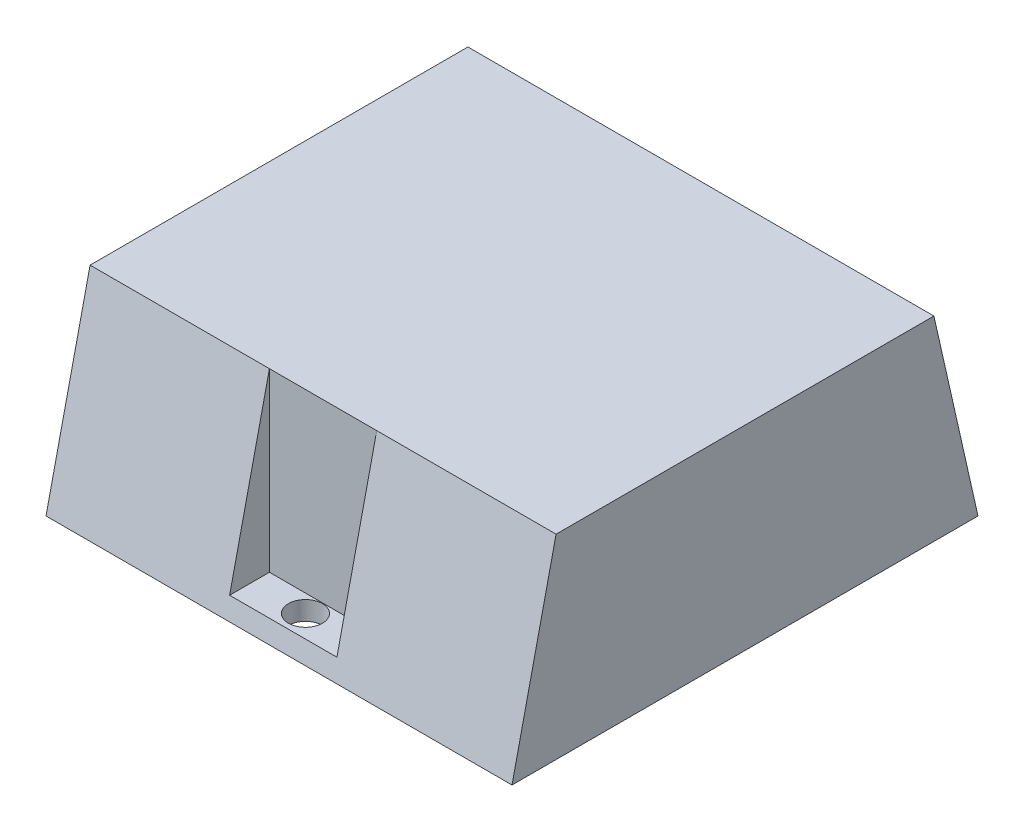
ISO-10303-21;
HEADER;
FILE_DESCRIPTION(('STEP AP214'),'2;1');
FILE_NAME('part.step','',(''),(''),'','','');
FILE_SCHEMA(('AUTOMOTIVE_DESIGN { 1 0 10303 214 1 1 1 1 }'));
ENDSEC;
DATA;
#1=APPLICATION_CONTEXT('core data for automotive mechanical design processes');
#2=APPLICATION_PROTOCOL_DEFINITION('international standard','automotive_design',2000,#1);
#3=PRODUCT_CONTEXT('',#1,'mechanical');
#4=PRODUCT('Part','Part','',(#3));
#5=PRODUCT_RELATED_PRODUCT_CATEGORY('part','',(#4));
#6=PRODUCT_DEFINITION_FORMATION('','',#4);
#7=PRODUCT_DEFINITION_CONTEXT('part definition',#1,'design');
#8=PRODUCT_DEFINITION('design','',#6,#7);
#9=PRODUCT_DEFINITION_SHAPE('','',#8);
#10=(LENGTH_UNIT() NAMED_UNIT(*) SI_UNIT(.MILLI.,.METRE.));
#11=(NAMED_UNIT(*) PLANE_ANGLE_UNIT() SI_UNIT($,.RADIAN.));
#12=(NAMED_UNIT(*) SI_UNIT($,.STERADIAN.) SOLID_ANGLE_UNIT());
#13=UNCERTAINTY_MEASURE_WITH_UNIT(LENGTH_MEASURE(1.E-05),#10,'distance_accuracy_value','');
#14=(GEOMETRIC_REPRESENTATION_CONTEXT(3) GLOBAL_UNCERTAINTY_ASSIGNED_CONTEXT((#13)) GLOBAL_UNIT_ASSIGNED_CONTEXT((#10,
#11,#12)) REPRESENTATION_CONTEXT('',''));
#15=CARTESIAN_POINT('',(0.,0.,0.));
#16=DIRECTION('',(0.,0.,1.));
#17=DIRECTION('',(1.,0.,0.));
#18=AXIS2_PLACEMENT_3D('',#15,#16,#17);
#19=CARTESIAN_POINT('',(37.,31.,30.));
#20=DIRECTION('',(0.,0.220260871434643,0.975441002067707));
#21=DIRECTION('',(0.,-0.975441002067707,0.220260871434643));
#22=AXIS2_PLACEMENT_3D('',#19,#20,#21);
#23=PLANE('',#22);
#24=DIRECTION('',(-1.,0.,0.));
#25=VECTOR('',#24,1.);
#26=CARTESIAN_POINT('',(37.,3.,36.3225806451613));
#27=LINE('',#26,#25);
#28=CARTESIAN_POINT('',(8.51943115093507,3.,36.3225806451613));
#29=VERTEX_POINT('',#28);
#30=CARTESIAN_POINT('',(-8.51943115093507,3.,36.3225806451613));
#31=VERTEX_POINT('',#30);
#32=EDGE_CURVE('E294',#29,#31,#27,.T.);
#33=ORIENTED_EDGE('',*,*,#32,.T.);
#34=DIRECTION('',(0.,0.975441002067707,-0.220260871434643));
#35=VECTOR('',#34,1.);
#36=CARTESIAN_POINT('',(-8.51943115093507,31.,30.));
#37=LINE('',#36,#35);
#38=CARTESIAN_POINT('',(-8.51943115093507,31.,30.));
#39=VERTEX_POINT('',#38);
#40=EDGE_CURVE('E12',#31,#39,#37,.T.);
#41=ORIENTED_EDGE('',*,*,#40,.T.);
#42=DIRECTION('',(-1.,0.,0.));
#43=VECTOR('',#42,1.);
#44=CARTESIAN_POINT('',(37.,31.,30.));
#45=LINE('',#44,#43);
#46=CARTESIAN_POINT('',(-37.,31.,30.));
#47=VERTEX_POINT('',#46);
#48=EDGE_CURVE('E247',#39,#47,#45,.T.);
#49=ORIENTED_EDGE('',*,*,#48,.T.);
#50=DIRECTION('',(0.,0.975441002067707,-0.220260871434643));
#51=VECTOR('',#50,1.);
#52=CARTESIAN_POINT('',(-37.,31.,30.));
#53=LINE('',#52,#51);
#54=CARTESIAN_POINT('',(-37.,0.,37.));
#55=VERTEX_POINT('',#54);
#56=EDGE_CURVE('E244',#55,#47,#53,.T.);
#57=ORIENTED_EDGE('',*,*,#56,.F.);
#58=DIRECTION('',(1.,0.,0.));
#59=VECTOR('',#58,1.);
#60=CARTESIAN_POINT('',(37.,0.,37.));
#61=LINE('',#60,#59);
#62=CARTESIAN_POINT('',(37.,0.,37.));
#63=VERTEX_POINT('',#62);
#64=EDGE_CURVE('E277',#55,#63,#61,.T.);
#65=ORIENTED_EDGE('',*,*,#64,.T.);
#66=DIRECTION('',(0.,0.975441002067707,-0.220260871434643));
#67=VECTOR('',#66,1.);
#68=CARTESIAN_POINT('',(37.,31.,30.));
#69=LINE('',#68,#67);
#70=CARTESIAN_POINT('',(37.,31.,30.));
#71=VERTEX_POINT('',#70);
#72=EDGE_CURVE('E243',#63,#71,#69,.T.);
#73=ORIENTED_EDGE('',*,*,#72,.T.);
#74=CARTESIAN_POINT('',(8.51943115093507,31.,30.));
#75=VERTEX_POINT('',#74);
#76=EDGE_CURVE('E260',#71,#75,#45,.T.);
#77=ORIENTED_EDGE('',*,*,#76,.T.);
#78=DIRECTION('',(0.,0.975441002067707,-0.220260871434643));
#79=VECTOR('',#78,1.);
#80=CARTESIAN_POINT('',(8.51943115093507,31.,30.));
#81=LINE('',#80,#79);
#82=EDGE_CURVE('E53',#29,#75,#81,.T.);
#83=ORIENTED_EDGE('',*,*,#82,.F.);
#84=EDGE_LOOP('',(#33,#41,#49,#57,#65,#73,#77,#83));
#85=FACE_BOUND('',#84,.T.);
#86=ADVANCED_FACE('F44',(#85),#23,.T.);
#87=CARTESIAN_POINT('',(37.,31.,-30.));
#88=DIRECTION('',(0.,0.220260871434644,-0.975441002067707));
#89=DIRECTION('',(0.,0.975441002067707,0.220260871434644));
#90=AXIS2_PLACEMENT_3D('',#87,#88,#89);
#91=PLANE('',#90);
#92=DIRECTION('',(-1.,0.,0.));
#93=VECTOR('',#92,1.);
#94=CARTESIAN_POINT('',(37.,31.,-30.));
#95=LINE('',#94,#93);
#96=CARTESIAN_POINT('',(-8.51943115093507,31.,-30.));
#97=VERTEX_POINT('',#96);
#98=CARTESIAN_POINT('',(-37.,31.,-30.));
#99=VERTEX_POINT('',#98);
#100=EDGE_CURVE('E259',#97,#99,#95,.T.);
#101=ORIENTED_EDGE('',*,*,#100,.F.);
#102=DIRECTION('',(0.,-0.975441002067707,-0.220260871434644));
#103=VECTOR('',#102,1.);
#104=CARTESIAN_POINT('',(-8.51943115093507,31.,-30.));
#105=LINE('',#104,#103);
#106=CARTESIAN_POINT('',(-8.51943115093507,3.,-36.3225806451613));
#107=VERTEX_POINT('',#106);
#108=EDGE_CURVE('E290',#97,#107,#105,.T.);
#109=ORIENTED_EDGE('',*,*,#108,.T.);
#110=DIRECTION('',(1.,0.,0.));
#111=VECTOR('',#110,1.);
#112=CARTESIAN_POINT('',(37.,3.,-36.3225806451613));
#113=LINE('',#112,#111);
#114=CARTESIAN_POINT('',(8.51943115093507,3.,-36.3225806451613));
#115=VERTEX_POINT('',#114);
#116=EDGE_CURVE('E273',#107,#115,#113,.T.);
#117=ORIENTED_EDGE('',*,*,#116,.T.);
#118=DIRECTION('',(0.,-0.975441002067707,-0.220260871434644));
#119=VECTOR('',#118,1.);
#120=CARTESIAN_POINT('',(8.51943115093507,31.,-30.));
#121=LINE('',#120,#119);
#122=CARTESIAN_POINT('',(8.51943115093507,31.,-30.));
#123=VERTEX_POINT('',#122);
#124=EDGE_CURVE('E168',#123,#115,#121,.T.);
#125=ORIENTED_EDGE('',*,*,#124,.F.);
#126=CARTESIAN_POINT('',(37.,31.,-30.));
#127=VERTEX_POINT('',#126);
#128=EDGE_CURVE('E254',#127,#123,#95,.T.);
#129=ORIENTED_EDGE('',*,*,#128,.F.);
#130=DIRECTION('',(0.,-0.975441002067707,-0.220260871434644));
#131=VECTOR('',#130,1.);
#132=CARTESIAN_POINT('',(37.,31.,-30.));
#133=LINE('',#132,#131);
#134=CARTESIAN_POINT('',(37.,0.,-37.));
#135=VERTEX_POINT('',#134);
#136=EDGE_CURVE('E240',#127,#135,#133,.T.);
#137=ORIENTED_EDGE('',*,*,#136,.T.);
#138=DIRECTION('',(-1.,0.,0.));
#139=VECTOR('',#138,1.);
#140=CARTESIAN_POINT('',(37.,0.,-37.));
#141=LINE('',#140,#139);
#142=CARTESIAN_POINT('',(-37.,0.,-37.));
#143=VERTEX_POINT('',#142);
#144=EDGE_CURVE('E269',#135,#143,#141,.T.);
#145=ORIENTED_EDGE('',*,*,#144,.T.);
#146=DIRECTION('',(0.,-0.975441002067707,-0.220260871434644));
#147=VECTOR('',#146,1.);
#148=CARTESIAN_POINT('',(-37.,31.,-30.));
#149=LINE('',#148,#147);
#150=EDGE_CURVE('E239',#99,#143,#149,.T.);
#151=ORIENTED_EDGE('',*,*,#150,.F.);
#152=EDGE_LOOP('',(#101,#109,#117,#125,#129,#137,#145,#151));
#153=FACE_BOUND('',#152,.T.);
#154=ADVANCED_FACE('F324',(#153),#91,.T.);
#155=CARTESIAN_POINT('',(-37.,31.,37.));
#156=DIRECTION('',(1.,0.,0.));
#157=DIRECTION('',(0.,0.,-1.));
#158=AXIS2_PLACEMENT_3D('',#155,#156,#157);
#159=PLANE('',#158);
#160=DIRECTION('',(0.,-1.,0.));
#161=VECTOR('',#160,1.);
#162=CARTESIAN_POINT('',(-37.,15.3493811961387,-15.77483006421));
#163=LINE('',#162,#161);
#164=CARTESIAN_POINT('',(-37.,15.3493811961387,-15.77483006421));
#165=VERTEX_POINT('',#164);
#166=CARTESIAN_POINT('',(-37.,0.,-15.77483006421));
#167=VERTEX_POINT('',#166);
#168=EDGE_CURVE('E179',#165,#167,#163,.T.);
#169=ORIENTED_EDGE('',*,*,#168,.F.);
#170=DIRECTION('',(0.,0.,-1.));
#171=VECTOR('',#170,1.);
#172=CARTESIAN_POINT('',(-37.,15.3493811961387,15.77483006421));
#173=LINE('',#172,#171);
#174=CARTESIAN_POINT('',(-37.,15.3493811961387,15.77483006421));
#175=VERTEX_POINT('',#174);
#176=EDGE_CURVE('E204',#175,#165,#173,.T.);
#177=ORIENTED_EDGE('',*,*,#176,.F.);
#178=DIRECTION('',(0.,1.,0.));
#179=VECTOR('',#178,1.);
#180=CARTESIAN_POINT('',(-37.,15.3493811961387,15.77483006421));
#181=LINE('',#180,#179);
#182=CARTESIAN_POINT('',(-37.,0.,15.77483006421));
#183=VERTEX_POINT('',#182);
#184=EDGE_CURVE('E217',#183,#175,#181,.T.);
#185=ORIENTED_EDGE('',*,*,#184,.F.);
#186=DIRECTION('',(0.,0.,1.));
#187=VECTOR('',#186,1.);
#188=CARTESIAN_POINT('',(-37.,0.,37.));
#189=LINE('',#188,#187);
#190=EDGE_CURVE('E258',#183,#55,#189,.T.);
#191=ORIENTED_EDGE('',*,*,#190,.T.);
#192=ORIENTED_EDGE('',*,*,#56,.T.);
#193=DIRECTION('',(0.,0.,1.));
#194=VECTOR('',#193,1.);
#195=CARTESIAN_POINT('',(-37.,31.,37.));
#196=LINE('',#195,#194);
#197=EDGE_CURVE('E264',#99,#47,#196,.T.);
#198=ORIENTED_EDGE('',*,*,#197,.F.);
#199=ORIENTED_EDGE('',*,*,#150,.T.);
#200=EDGE_CURVE('E274',#143,#167,#189,.T.);
#201=ORIENTED_EDGE('',*,*,#200,.T.);
#202=EDGE_LOOP('',(#169,#177,#185,#191,#192,#198,#199,#201));
#203=FACE_BOUND('',#202,.T.);
#204=ADVANCED_FACE('F46',(#203),#159,.F.);
#205=CARTESIAN_POINT('',(37.,31.,37.));
#206=DIRECTION('',(-1.,0.,0.));
#207=DIRECTION('',(0.,0.,1.));
#208=AXIS2_PLACEMENT_3D('',#205,#206,#207);
#209=PLANE('',#208);
#210=ORIENTED_EDGE('',*,*,#136,.F.);
#211=DIRECTION('',(0.,0.,-1.));
#212=VECTOR('',#211,1.);
#213=CARTESIAN_POINT('',(37.,31.,37.));
#214=LINE('',#213,#212);
#215=EDGE_CURVE('E268',#71,#127,#214,.T.);
#216=ORIENTED_EDGE('',*,*,#215,.F.);
#217=ORIENTED_EDGE('',*,*,#72,.F.);
#218=DIRECTION('',(0.,0.,-1.));
#219=VECTOR('',#218,1.);
#220=CARTESIAN_POINT('',(37.,0.,37.));
#221=LINE('',#220,#219);
#222=EDGE_CURVE('E280',#63,#135,#221,.T.);
#223=ORIENTED_EDGE('',*,*,#222,.T.);
#224=EDGE_LOOP('',(#210,#216,#217,#223));
#225=FACE_BOUND('',#224,.T.);
#226=ADVANCED_FACE('F315',(#225),#209,.F.);
#227=CARTESIAN_POINT('',(0.,31.,0.));
#228=DIRECTION('',(0.,1.,0.));
#229=DIRECTION('',(0.,0.,1.));
#230=AXIS2_PLACEMENT_3D('',#227,#228,#229);
#231=PLANE('',#230);
#232=ORIENTED_EDGE('',*,*,#215,.T.);
#233=ORIENTED_EDGE('',*,*,#128,.T.);
#234=DIRECTION('',(-1.,0.,0.));
#235=VECTOR('',#234,1.);
#236=CARTESIAN_POINT('',(0.,31.,-30.));
#237=LINE('',#236,#235);
#238=EDGE_CURVE('E152',#123,#97,#237,.T.);
#239=ORIENTED_EDGE('',*,*,#238,.T.);
#240=ORIENTED_EDGE('',*,*,#100,.T.);
#241=ORIENTED_EDGE('',*,*,#197,.T.);
#242=ORIENTED_EDGE('',*,*,#48,.F.);
#243=DIRECTION('',(1.,0.,0.));
#244=VECTOR('',#243,1.);
#245=CARTESIAN_POINT('',(0.,31.,30.));
#246=LINE('',#245,#244);
#247=EDGE_CURVE('E185',#39,#75,#246,.T.);
#248=ORIENTED_EDGE('',*,*,#247,.T.);
#249=ORIENTED_EDGE('',*,*,#76,.F.);
#250=EDGE_LOOP('',(#232,#233,#239,#240,#241,#242,#248,#249));
#251=FACE_BOUND('',#250,.T.);
#252=ADVANCED_FACE('F306',(#251),#231,.T.);
#253=CARTESIAN_POINT('',(0.,0.,0.));
#254=DIRECTION('',(0.,1.,0.));
#255=DIRECTION('',(0.,0.,1.));
#256=AXIS2_PLACEMENT_3D('',#253,#254,#255);
#257=PLANE('',#256);
#258=CARTESIAN_POINT('',(0.,0.,32.8));
#259=DIRECTION('',(0.,1.,0.));
#260=DIRECTION('',(0.,0.,1.));
#261=AXIS2_PLACEMENT_3D('',#258,#259,#260);
#262=CIRCLE('',#261,2.69999999999995);
#263=CARTESIAN_POINT('',(0.,0.,35.4999999999999));
#264=VERTEX_POINT('',#263);
#265=EDGE_CURVE('E594',#264,#264,#262,.T.);
#266=ORIENTED_EDGE('',*,*,#265,.T.);
#267=EDGE_LOOP('',(#266));
#268=FACE_BOUND('',#267,.T.);
#269=CARTESIAN_POINT('',(0.,0.,-32.8));
#270=DIRECTION('',(0.,1.,0.));
#271=DIRECTION('',(0.,0.,1.));
#272=AXIS2_PLACEMENT_3D('',#269,#270,#271);
#273=CIRCLE('',#272,2.70000000000001);
#274=CARTESIAN_POINT('',(0.,0.,-30.1));
#275=VERTEX_POINT('',#274);
#276=EDGE_CURVE('E194',#275,#275,#273,.T.);
#277=ORIENTED_EDGE('',*,*,#276,.T.);
#278=EDGE_LOOP('',(#277));
#279=FACE_BOUND('',#278,.T.);
#280=ORIENTED_EDGE('',*,*,#200,.F.);
#281=ORIENTED_EDGE('',*,*,#144,.F.);
#282=ORIENTED_EDGE('',*,*,#222,.F.);
#283=ORIENTED_EDGE('',*,*,#64,.F.);
#284=ORIENTED_EDGE('',*,*,#190,.F.);
#285=DIRECTION('',(1.,0.,0.));
#286=VECTOR('',#285,1.);
#287=CARTESIAN_POINT('',(-40.,0.,15.77483006421));
#288=LINE('',#287,#286);
#289=CARTESIAN_POINT('',(-40.,0.,15.77483006421));
#290=VERTEX_POINT('',#289);
#291=EDGE_CURVE('E231',#290,#183,#288,.T.);
#292=ORIENTED_EDGE('',*,*,#291,.F.);
#293=DIRECTION('',(0.,0.,1.));
#294=VECTOR('',#293,1.);
#295=CARTESIAN_POINT('',(-40.,0.,15.77483006421));
#296=LINE('',#295,#294);
#297=CARTESIAN_POINT('',(-40.,0.,-15.77483006421));
#298=VERTEX_POINT('',#297);
#299=EDGE_CURVE('E203',#298,#290,#296,.T.);
#300=ORIENTED_EDGE('',*,*,#299,.F.);
#301=DIRECTION('',(1.,0.,0.));
#302=VECTOR('',#301,1.);
#303=CARTESIAN_POINT('',(-40.,0.,-15.77483006421));
#304=LINE('',#303,#302);
#305=EDGE_CURVE('E235',#298,#167,#304,.T.);
#306=ORIENTED_EDGE('',*,*,#305,.T.);
#307=EDGE_LOOP('',(#280,#281,#282,#283,#284,#292,#300,#306));
#308=FACE_BOUND('',#307,.T.);
#309=ADVANCED_FACE('F319',(#268,#279,#308),#257,.F.);
#310=CARTESIAN_POINT('',(-40.,15.3493811961387,-15.77483006421));
#311=DIRECTION('',(0.,0.,1.));
#312=DIRECTION('',(1.,0.,0.));
#313=AXIS2_PLACEMENT_3D('',#310,#311,#312);
#314=PLANE('',#313);
#315=ORIENTED_EDGE('',*,*,#168,.T.);
#316=ORIENTED_EDGE('',*,*,#305,.F.);
#317=DIRECTION('',(0.,-1.,0.));
#318=VECTOR('',#317,1.);
#319=CARTESIAN_POINT('',(-40.,15.3493811961387,-15.77483006421));
#320=LINE('',#319,#318);
#321=CARTESIAN_POINT('',(-40.,15.3493811961387,-15.77483006421));
#322=VERTEX_POINT('',#321);
#323=EDGE_CURVE('E199',#322,#298,#320,.T.);
#324=ORIENTED_EDGE('',*,*,#323,.F.);
#325=DIRECTION('',(1.,0.,0.));
#326=VECTOR('',#325,1.);
#327=CARTESIAN_POINT('',(-40.,15.3493811961387,-15.77483006421));
#328=LINE('',#327,#326);
#329=EDGE_CURVE('E213',#322,#165,#328,.T.);
#330=ORIENTED_EDGE('',*,*,#329,.T.);
#331=EDGE_LOOP('',(#315,#316,#324,#330));
#332=FACE_BOUND('',#331,.T.);
#333=ADVANCED_FACE('F352',(#332),#314,.F.);
#334=CARTESIAN_POINT('',(-40.,15.3493811961387,15.77483006421));
#335=DIRECTION('',(0.,0.,-1.));
#336=DIRECTION('',(-1.,0.,0.));
#337=AXIS2_PLACEMENT_3D('',#334,#335,#336);
#338=PLANE('',#337);
#339=ORIENTED_EDGE('',*,*,#184,.T.);
#340=DIRECTION('',(1.,0.,0.));
#341=VECTOR('',#340,1.);
#342=CARTESIAN_POINT('',(-40.,15.3493811961387,15.77483006421));
#343=LINE('',#342,#341);
#344=CARTESIAN_POINT('',(-40.,15.3493811961387,15.77483006421));
#345=VERTEX_POINT('',#344);
#346=EDGE_CURVE('E227',#345,#175,#343,.T.);
#347=ORIENTED_EDGE('',*,*,#346,.F.);
#348=DIRECTION('',(0.,1.,0.));
#349=VECTOR('',#348,1.);
#350=CARTESIAN_POINT('',(-40.,15.3493811961387,15.77483006421));
#351=LINE('',#350,#349);
#352=EDGE_CURVE('E207',#290,#345,#351,.T.);
#353=ORIENTED_EDGE('',*,*,#352,.F.);
#354=ORIENTED_EDGE('',*,*,#291,.T.);
#355=EDGE_LOOP('',(#339,#347,#353,#354));
#356=FACE_BOUND('',#355,.T.);
#357=ADVANCED_FACE('F535',(#356),#338,.F.);
#358=CARTESIAN_POINT('',(-40.,15.3493811961387,15.77483006421));
#359=DIRECTION('',(0.,-1.,0.));
#360=DIRECTION('',(0.,0.,-1.));
#361=AXIS2_PLACEMENT_3D('',#358,#359,#360);
#362=PLANE('',#361);
#363=ORIENTED_EDGE('',*,*,#176,.T.);
#364=ORIENTED_EDGE('',*,*,#329,.F.);
#365=DIRECTION('',(0.,0.,-1.));
#366=VECTOR('',#365,1.);
#367=CARTESIAN_POINT('',(-40.,15.3493811961387,15.77483006421));
#368=LINE('',#367,#366);
#369=EDGE_CURVE('E210',#345,#322,#368,.T.);
#370=ORIENTED_EDGE('',*,*,#369,.F.);
#371=ORIENTED_EDGE('',*,*,#346,.T.);
#372=EDGE_LOOP('',(#363,#364,#370,#371));
#373=FACE_BOUND('',#372,.T.);
#374=ADVANCED_FACE('F524',(#373),#362,.F.);
#375=CARTESIAN_POINT('',(-40.,0.,0.));
#376=DIRECTION('',(1.,0.,0.));
#377=DIRECTION('',(0.,0.,-1.));
#378=AXIS2_PLACEMENT_3D('',#375,#376,#377);
#379=PLANE('',#378);
#380=ORIENTED_EDGE('',*,*,#323,.T.);
#381=ORIENTED_EDGE('',*,*,#299,.T.);
#382=ORIENTED_EDGE('',*,*,#352,.T.);
#383=ORIENTED_EDGE('',*,*,#369,.T.);
#384=EDGE_LOOP('',(#380,#381,#382,#383));
#385=FACE_BOUND('',#384,.T.);
#386=ADVANCED_FACE('F393',(#385),#379,.F.);
#387=CARTESIAN_POINT('',(0.,3.,-30.));
#388=DIRECTION('',(0.,0.,-1.));
#389=DIRECTION('',(-1.,0.,0.));
#390=AXIS2_PLACEMENT_3D('',#387,#388,#389);
#391=PLANE('',#390);
#392=ORIENTED_EDGE('',*,*,#238,.F.);
#393=DIRECTION('',(0.,1.,0.));
#394=VECTOR('',#393,1.);
#395=CARTESIAN_POINT('',(8.51943115093507,3.,-30.));
#396=LINE('',#395,#394);
#397=CARTESIAN_POINT('',(8.51943115093507,3.,-30.));
#398=VERTEX_POINT('',#397);
#399=EDGE_CURVE('E147',#398,#123,#396,.T.);
#400=ORIENTED_EDGE('',*,*,#399,.F.);
#401=DIRECTION('',(-1.,0.,0.));
#402=VECTOR('',#401,1.);
#403=CARTESIAN_POINT('',(0.,3.,-30.));
#404=LINE('',#403,#402);
#405=CARTESIAN_POINT('',(-8.51943115093507,3.,-30.));
#406=VERTEX_POINT('',#405);
#407=EDGE_CURVE('E150',#398,#406,#404,.T.);
#408=ORIENTED_EDGE('',*,*,#407,.T.);
#409=DIRECTION('',(0.,1.,0.));
#410=VECTOR('',#409,1.);
#411=CARTESIAN_POINT('',(-8.51943115093507,3.,-30.));
#412=LINE('',#411,#410);
#413=EDGE_CURVE('E68',#406,#97,#412,.T.);
#414=ORIENTED_EDGE('',*,*,#413,.T.);
#415=EDGE_LOOP('',(#392,#400,#408,#414));
#416=FACE_BOUND('',#415,.T.);
#417=ADVANCED_FACE('F149',(#416),#391,.T.);
#418=CARTESIAN_POINT('',(-8.51943115093507,3.,0.));
#419=DIRECTION('',(1.,0.,0.));
#420=DIRECTION('',(0.,0.,-1.));
#421=AXIS2_PLACEMENT_3D('',#418,#419,#420);
#422=PLANE('',#421);
#423=ORIENTED_EDGE('',*,*,#413,.F.);
#424=DIRECTION('',(0.,0.,-1.));
#425=VECTOR('',#424,1.);
#426=CARTESIAN_POINT('',(-8.51943115093507,3.,0.));
#427=LINE('',#426,#425);
#428=EDGE_CURVE('E157',#406,#107,#427,.T.);
#429=ORIENTED_EDGE('',*,*,#428,.T.);
#430=ORIENTED_EDGE('',*,*,#108,.F.);
#431=EDGE_LOOP('',(#423,#429,#430));
#432=FACE_BOUND('',#431,.T.);
#433=ADVANCED_FACE('F392',(#432),#422,.T.);
#434=CARTESIAN_POINT('',(8.51943115093507,3.,0.));
#435=DIRECTION('',(1.,0.,0.));
#436=DIRECTION('',(0.,0.,-1.));
#437=AXIS2_PLACEMENT_3D('',#434,#435,#436);
#438=PLANE('',#437);
#439=ORIENTED_EDGE('',*,*,#124,.T.);
#440=DIRECTION('',(0.,0.,-1.));
#441=VECTOR('',#440,1.);
#442=CARTESIAN_POINT('',(8.51943115093507,3.,0.));
#443=LINE('',#442,#441);
#444=EDGE_CURVE('E162',#398,#115,#443,.T.);
#445=ORIENTED_EDGE('',*,*,#444,.F.);
#446=ORIENTED_EDGE('',*,*,#399,.T.);
#447=EDGE_LOOP('',(#439,#445,#446));
#448=FACE_BOUND('',#447,.T.);
#449=ADVANCED_FACE('F167',(#448),#438,.F.);
#450=CARTESIAN_POINT('',(0.,3.,0.));
#451=DIRECTION('',(0.,1.,0.));
#452=DIRECTION('',(0.,0.,1.));
#453=AXIS2_PLACEMENT_3D('',#450,#451,#452);
#454=PLANE('',#453);
#455=CARTESIAN_POINT('',(0.,3.,-32.8));
#456=DIRECTION('',(0.,1.,0.));
#457=DIRECTION('',(0.,0.,1.));
#458=AXIS2_PLACEMENT_3D('',#455,#456,#457);
#459=CIRCLE('',#458,2.70000000000001);
#460=CARTESIAN_POINT('',(0.,3.,-30.1));
#461=VERTEX_POINT('',#460);
#462=EDGE_CURVE('E589',#461,#461,#459,.T.);
#463=ORIENTED_EDGE('',*,*,#462,.F.);
#464=EDGE_LOOP('',(#463));
#465=FACE_BOUND('',#464,.T.);
#466=ORIENTED_EDGE('',*,*,#428,.F.);
#467=ORIENTED_EDGE('',*,*,#407,.F.);
#468=ORIENTED_EDGE('',*,*,#444,.T.);
#469=ORIENTED_EDGE('',*,*,#116,.F.);
#470=EDGE_LOOP('',(#466,#467,#468,#469));
#471=FACE_BOUND('',#470,.T.);
#472=ADVANCED_FACE('F161',(#465,#471),#454,.T.);
#473=CARTESIAN_POINT('',(-8.51943115093507,3.,0.));
#474=DIRECTION('',(1.,0.,0.));
#475=DIRECTION('',(0.,0.,-1.));
#476=AXIS2_PLACEMENT_3D('',#473,#474,#475);
#477=PLANE('',#476);
#478=DIRECTION('',(0.,0.,-1.));
#479=VECTOR('',#478,1.);
#480=CARTESIAN_POINT('',(-8.51943115093507,3.,0.));
#481=LINE('',#480,#479);
#482=CARTESIAN_POINT('',(-8.51943115093507,3.,30.));
#483=VERTEX_POINT('',#482);
#484=EDGE_CURVE('E188',#31,#483,#481,.T.);
#485=ORIENTED_EDGE('',*,*,#484,.T.);
#486=DIRECTION('',(0.,1.,0.));
#487=VECTOR('',#486,1.);
#488=CARTESIAN_POINT('',(-8.51943115093507,3.,30.));
#489=LINE('',#488,#487);
#490=EDGE_CURVE('E177',#483,#39,#489,.T.);
#491=ORIENTED_EDGE('',*,*,#490,.T.);
#492=ORIENTED_EDGE('',*,*,#40,.F.);
#493=EDGE_LOOP('',(#485,#491,#492));
#494=FACE_BOUND('',#493,.T.);
#495=ADVANCED_FACE('F332',(#494),#477,.T.);
#496=CARTESIAN_POINT('',(0.,3.,30.));
#497=DIRECTION('',(0.,0.,1.));
#498=DIRECTION('',(1.,0.,0.));
#499=AXIS2_PLACEMENT_3D('',#496,#497,#498);
#500=PLANE('',#499);
#501=ORIENTED_EDGE('',*,*,#247,.F.);
#502=ORIENTED_EDGE('',*,*,#490,.F.);
#503=DIRECTION('',(1.,0.,0.));
#504=VECTOR('',#503,1.);
#505=CARTESIAN_POINT('',(0.,3.,30.));
#506=LINE('',#505,#504);
#507=CARTESIAN_POINT('',(8.51943115093507,3.,30.));
#508=VERTEX_POINT('',#507);
#509=EDGE_CURVE('E184',#483,#508,#506,.T.);
#510=ORIENTED_EDGE('',*,*,#509,.T.);
#511=DIRECTION('',(0.,1.,0.));
#512=VECTOR('',#511,1.);
#513=CARTESIAN_POINT('',(8.51943115093507,3.,30.));
#514=LINE('',#513,#512);
#515=EDGE_CURVE('E60',#508,#75,#514,.T.);
#516=ORIENTED_EDGE('',*,*,#515,.T.);
#517=EDGE_LOOP('',(#501,#502,#510,#516));
#518=FACE_BOUND('',#517,.T.);
#519=ADVANCED_FACE('F336',(#518),#500,.T.);
#520=CARTESIAN_POINT('',(8.51943115093507,3.,0.));
#521=DIRECTION('',(1.,0.,0.));
#522=DIRECTION('',(0.,0.,-1.));
#523=AXIS2_PLACEMENT_3D('',#520,#521,#522);
#524=PLANE('',#523);
#525=ORIENTED_EDGE('',*,*,#82,.T.);
#526=ORIENTED_EDGE('',*,*,#515,.F.);
#527=DIRECTION('',(0.,0.,-1.));
#528=VECTOR('',#527,1.);
#529=CARTESIAN_POINT('',(8.51943115093507,3.,0.));
#530=LINE('',#529,#528);
#531=EDGE_CURVE('E181',#29,#508,#530,.T.);
#532=ORIENTED_EDGE('',*,*,#531,.F.);
#533=EDGE_LOOP('',(#525,#526,#532));
#534=FACE_BOUND('',#533,.T.);
#535=ADVANCED_FACE('F301',(#534),#524,.F.);
#536=CARTESIAN_POINT('',(0.,3.,0.));
#537=DIRECTION('',(0.,1.,0.));
#538=DIRECTION('',(0.,0.,1.));
#539=AXIS2_PLACEMENT_3D('',#536,#537,#538);
#540=PLANE('',#539);
#541=CARTESIAN_POINT('',(0.,3.,32.8));
#542=DIRECTION('',(0.,1.,0.));
#543=DIRECTION('',(0.,0.,1.));
#544=AXIS2_PLACEMENT_3D('',#541,#542,#543);
#545=CIRCLE('',#544,2.69999999999995);
#546=CARTESIAN_POINT('',(0.,3.,35.4999999999999));
#547=VERTEX_POINT('',#546);
#548=EDGE_CURVE('E597',#547,#547,#545,.T.);
#549=ORIENTED_EDGE('',*,*,#548,.F.);
#550=EDGE_LOOP('',(#549));
#551=FACE_BOUND('',#550,.T.);
#552=ORIENTED_EDGE('',*,*,#531,.T.);
#553=ORIENTED_EDGE('',*,*,#509,.F.);
#554=ORIENTED_EDGE('',*,*,#484,.F.);
#555=ORIENTED_EDGE('',*,*,#32,.F.);
#556=EDGE_LOOP('',(#552,#553,#554,#555));
#557=FACE_BOUND('',#556,.T.);
#558=ADVANCED_FACE('F335',(#551,#557),#540,.T.);
#559=CARTESIAN_POINT('',(0.,-25.,32.8));
#560=DIRECTION('',(0.,1.,0.));
#561=DIRECTION('',(0.,0.,1.));
#562=AXIS2_PLACEMENT_3D('',#559,#560,#561);
#563=CYLINDRICAL_SURFACE('',#562,2.69999999999995);
#564=ORIENTED_EDGE('',*,*,#548,.T.);
#565=EDGE_LOOP('',(#564));
#566=FACE_BOUND('',#565,.T.);
#567=ORIENTED_EDGE('',*,*,#265,.F.);
#568=EDGE_LOOP('',(#567));
#569=FACE_BOUND('',#568,.T.);
#570=ADVANCED_FACE('F463',(#566,#569),#563,.F.);
#571=CARTESIAN_POINT('',(0.,-25.,-32.8));
#572=DIRECTION('',(0.,1.,0.));
#573=DIRECTION('',(0.,0.,1.));
#574=AXIS2_PLACEMENT_3D('',#571,#572,#573);
#575=CYLINDRICAL_SURFACE('',#574,2.70000000000001);
#576=ORIENTED_EDGE('',*,*,#462,.T.);
#577=EDGE_LOOP('',(#576));
#578=FACE_BOUND('',#577,.T.);
#579=ORIENTED_EDGE('',*,*,#276,.F.);
#580=EDGE_LOOP('',(#579));
#581=FACE_BOUND('',#580,.T.);
#582=ADVANCED_FACE('F474',(#578,#581),#575,.F.);
#583=CLOSED_SHELL('',(#86,#154,#204,#226,#252,#309,#333,#357,#374,#386,#417,#433,#449,#472,#495,
#519,#535,#558,#570,#582));
#584=MANIFOLD_SOLID_BREP('B2',#583);
#585=ADVANCED_BREP_SHAPE_REPRESENTATION('',(#18,#584),#14);
#586=SHAPE_DEFINITION_REPRESENTATION(#9,#585);
ENDSEC;
END-ISO-10303-21;
